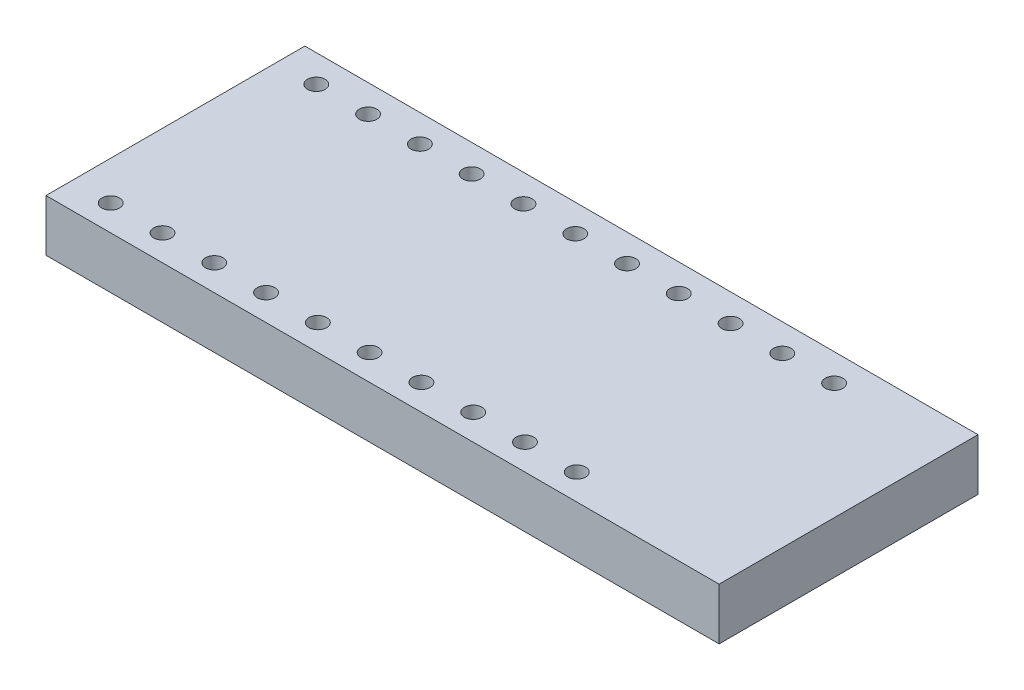
ISO-10303-21;
HEADER;
FILE_DESCRIPTION(('STEP AP214'),'2;1');
FILE_NAME('part.step','',(''),(''),'','','');
FILE_SCHEMA(('AUTOMOTIVE_DESIGN { 1 0 10303 214 1 1 1 1 }'));
ENDSEC;
DATA;
#1=APPLICATION_CONTEXT('core data for automotive mechanical design processes');
#2=APPLICATION_PROTOCOL_DEFINITION('international standard','automotive_design',2000,#1);
#3=PRODUCT_CONTEXT('',#1,'mechanical');
#4=PRODUCT('Part','Part','',(#3));
#5=PRODUCT_RELATED_PRODUCT_CATEGORY('part','',(#4));
#6=PRODUCT_DEFINITION_FORMATION('','',#4);
#7=PRODUCT_DEFINITION_CONTEXT('part definition',#1,'design');
#8=PRODUCT_DEFINITION('design','',#6,#7);
#9=PRODUCT_DEFINITION_SHAPE('','',#8);
#10=(LENGTH_UNIT() NAMED_UNIT(*) SI_UNIT(.MILLI.,.METRE.));
#11=(NAMED_UNIT(*) PLANE_ANGLE_UNIT() SI_UNIT($,.RADIAN.));
#12=(NAMED_UNIT(*) SI_UNIT($,.STERADIAN.) SOLID_ANGLE_UNIT());
#13=UNCERTAINTY_MEASURE_WITH_UNIT(LENGTH_MEASURE(1.E-05),#10,'distance_accuracy_value','');
#14=(GEOMETRIC_REPRESENTATION_CONTEXT(3) GLOBAL_UNCERTAINTY_ASSIGNED_CONTEXT((#13)) GLOBAL_UNIT_ASSIGNED_CONTEXT((#10,
#11,#12)) REPRESENTATION_CONTEXT('',''));
#15=CARTESIAN_POINT('',(0.,0.,0.));
#16=DIRECTION('',(0.,0.,1.));
#17=DIRECTION('',(1.,0.,0.));
#18=AXIS2_PLACEMENT_3D('',#15,#16,#17);
#19=CARTESIAN_POINT('',(-1.46746064493749E-13,432.678485814157,0.));
#20=DIRECTION('',(0.,1.,0.));
#21=DIRECTION('',(-1.,0.,0.));
#22=AXIS2_PLACEMENT_3D('',#19,#20,#21);
#23=PLANE('',#22);
#24=DIRECTION('',(1.,0.,0.));
#25=VECTOR('',#24,1.);
#26=CARTESIAN_POINT('',(-74.1708234911027,432.678485814157,-31.75));
#27=LINE('',#26,#25);
#28=CARTESIAN_POINT('',(-239.270823491103,432.678485814157,-31.75));
#29=VERTEX_POINT('',#28);
#30=CARTESIAN_POINT('',(-74.1708234911027,432.678485814157,-31.75));
#31=VERTEX_POINT('',#30);
#32=EDGE_CURVE('E171',#29,#31,#27,.T.);
#33=ORIENTED_EDGE('',*,*,#32,.T.);
#34=DIRECTION('',(0.,0.,1.));
#35=VECTOR('',#34,1.);
#36=CARTESIAN_POINT('',(-74.1708234911027,432.678485814157,-31.75));
#37=LINE('',#36,#35);
#38=CARTESIAN_POINT('',(-74.1708234911027,432.678485814157,31.75));
#39=VERTEX_POINT('',#38);
#40=EDGE_CURVE('E83',#31,#39,#37,.T.);
#41=ORIENTED_EDGE('',*,*,#40,.T.);
#42=DIRECTION('',(-1.,0.,0.));
#43=VECTOR('',#42,1.);
#44=CARTESIAN_POINT('',(-74.1708234911027,432.678485814157,31.75));
#45=LINE('',#44,#43);
#46=CARTESIAN_POINT('',(-239.270823491103,432.678485814157,31.75));
#47=VERTEX_POINT('',#46);
#48=EDGE_CURVE('E56',#39,#47,#45,.T.);
#49=ORIENTED_EDGE('',*,*,#48,.T.);
#50=DIRECTION('',(0.,0.,-1.));
#51=VECTOR('',#50,1.);
#52=CARTESIAN_POINT('',(-239.270823491103,432.678485814157,-31.75));
#53=LINE('',#52,#51);
#54=EDGE_CURVE('E53',#47,#29,#53,.T.);
#55=ORIENTED_EDGE('',*,*,#54,.T.);
#56=EDGE_LOOP('',(#33,#41,#49,#55));
#57=FACE_BOUND('',#56,.T.);
#58=CARTESIAN_POINT('',(-115.445823491103,432.678485814157,25.4000000000008));
#59=DIRECTION('',(0.,-1.,0.));
#60=DIRECTION('',(1.,0.,0.));
#61=AXIS2_PLACEMENT_3D('',#58,#59,#60);
#62=CIRCLE('',#61,2.15899999999999);
#63=CARTESIAN_POINT('',(-113.286823491103,432.678485814157,25.4000000000008));
#64=VERTEX_POINT('',#63);
#65=EDGE_CURVE('E166',#64,#64,#62,.T.);
#66=ORIENTED_EDGE('',*,*,#65,.F.);
#67=EDGE_LOOP('',(#66));
#68=FACE_BOUND('',#67,.T.);
#69=CARTESIAN_POINT('',(-128.145823491103,432.678485814157,25.4000000000007));
#70=DIRECTION('',(0.,-1.,0.));
#71=DIRECTION('',(1.,0.,0.));
#72=AXIS2_PLACEMENT_3D('',#69,#70,#71);
#73=CIRCLE('',#72,2.15899999999999);
#74=CARTESIAN_POINT('',(-125.986823491103,432.678485814157,25.4000000000007));
#75=VERTEX_POINT('',#74);
#76=EDGE_CURVE('E164',#75,#75,#73,.T.);
#77=ORIENTED_EDGE('',*,*,#76,.F.);
#78=EDGE_LOOP('',(#77));
#79=FACE_BOUND('',#78,.T.);
#80=CARTESIAN_POINT('',(-140.845823491103,432.678485814157,25.4000000000006));
#81=DIRECTION('',(0.,-1.,0.));
#82=DIRECTION('',(1.,0.,0.));
#83=AXIS2_PLACEMENT_3D('',#80,#81,#82);
#84=CIRCLE('',#83,2.15899999999999);
#85=CARTESIAN_POINT('',(-138.686823491103,432.678485814157,25.4000000000006));
#86=VERTEX_POINT('',#85);
#87=EDGE_CURVE('E162',#86,#86,#84,.T.);
#88=ORIENTED_EDGE('',*,*,#87,.F.);
#89=EDGE_LOOP('',(#88));
#90=FACE_BOUND('',#89,.T.);
#91=CARTESIAN_POINT('',(-153.545823491103,432.678485814157,25.4000000000005));
#92=DIRECTION('',(0.,-1.,0.));
#93=DIRECTION('',(1.,0.,0.));
#94=AXIS2_PLACEMENT_3D('',#91,#92,#93);
#95=CIRCLE('',#94,2.15899999999999);
#96=CARTESIAN_POINT('',(-151.386823491103,432.678485814157,25.4000000000005));
#97=VERTEX_POINT('',#96);
#98=EDGE_CURVE('E158',#97,#97,#95,.T.);
#99=ORIENTED_EDGE('',*,*,#98,.F.);
#100=EDGE_LOOP('',(#99));
#101=FACE_BOUND('',#100,.T.);
#102=CARTESIAN_POINT('',(-166.245823491103,432.678485814157,25.4000000000004));
#103=DIRECTION('',(0.,-1.,0.));
#104=DIRECTION('',(1.,0.,0.));
#105=AXIS2_PLACEMENT_3D('',#102,#103,#104);
#106=CIRCLE('',#105,2.15899999999999);
#107=CARTESIAN_POINT('',(-164.086823491103,432.678485814157,25.4000000000004));
#108=VERTEX_POINT('',#107);
#109=EDGE_CURVE('E156',#108,#108,#106,.T.);
#110=ORIENTED_EDGE('',*,*,#109,.F.);
#111=EDGE_LOOP('',(#110));
#112=FACE_BOUND('',#111,.T.);
#113=CARTESIAN_POINT('',(-178.945823491103,432.678485814157,25.4000000000004));
#114=DIRECTION('',(0.,-1.,0.));
#115=DIRECTION('',(1.,0.,0.));
#116=AXIS2_PLACEMENT_3D('',#113,#114,#115);
#117=CIRCLE('',#116,2.15899999999997);
#118=CARTESIAN_POINT('',(-176.786823491103,432.678485814157,25.4000000000004));
#119=VERTEX_POINT('',#118);
#120=EDGE_CURVE('E155',#119,#119,#117,.T.);
#121=ORIENTED_EDGE('',*,*,#120,.F.);
#122=EDGE_LOOP('',(#121));
#123=FACE_BOUND('',#122,.T.);
#124=CARTESIAN_POINT('',(-191.645823491103,432.678485814157,25.4000000000003));
#125=DIRECTION('',(0.,-1.,0.));
#126=DIRECTION('',(1.,0.,0.));
#127=AXIS2_PLACEMENT_3D('',#124,#125,#126);
#128=CIRCLE('',#127,2.15899999999999);
#129=CARTESIAN_POINT('',(-189.486823491103,432.678485814157,25.4000000000003));
#130=VERTEX_POINT('',#129);
#131=EDGE_CURVE('E146',#130,#130,#128,.T.);
#132=ORIENTED_EDGE('',*,*,#131,.F.);
#133=EDGE_LOOP('',(#132));
#134=FACE_BOUND('',#133,.T.);
#135=CARTESIAN_POINT('',(-204.345823491103,432.678485814157,25.4000000000002));
#136=DIRECTION('',(0.,-1.,0.));
#137=DIRECTION('',(1.,0.,0.));
#138=AXIS2_PLACEMENT_3D('',#135,#136,#137);
#139=CIRCLE('',#138,2.15899999999999);
#140=CARTESIAN_POINT('',(-202.186823491103,432.678485814157,25.4000000000002));
#141=VERTEX_POINT('',#140);
#142=EDGE_CURVE('E150',#141,#141,#139,.T.);
#143=ORIENTED_EDGE('',*,*,#142,.F.);
#144=EDGE_LOOP('',(#143));
#145=FACE_BOUND('',#144,.T.);
#146=CARTESIAN_POINT('',(-217.045823491103,432.678485814157,25.4000000000001));
#147=DIRECTION('',(0.,-1.,0.));
#148=DIRECTION('',(1.,0.,0.));
#149=AXIS2_PLACEMENT_3D('',#146,#147,#148);
#150=CIRCLE('',#149,2.15899999999999);
#151=CARTESIAN_POINT('',(-214.886823491103,432.678485814157,25.4000000000001));
#152=VERTEX_POINT('',#151);
#153=EDGE_CURVE('E144',#152,#152,#150,.T.);
#154=ORIENTED_EDGE('',*,*,#153,.F.);
#155=EDGE_LOOP('',(#154));
#156=FACE_BOUND('',#155,.T.);
#157=CARTESIAN_POINT('',(-229.745823491103,432.678485814157,25.4));
#158=DIRECTION('',(0.,-1.,0.));
#159=DIRECTION('',(1.,0.,0.));
#160=AXIS2_PLACEMENT_3D('',#157,#158,#159);
#161=CIRCLE('',#160,2.15899999999999);
#162=CARTESIAN_POINT('',(-227.586823491103,432.678485814157,25.4));
#163=VERTEX_POINT('',#162);
#164=EDGE_CURVE('E142',#163,#163,#161,.T.);
#165=ORIENTED_EDGE('',*,*,#164,.F.);
#166=EDGE_LOOP('',(#165));
#167=FACE_BOUND('',#166,.T.);
#168=CARTESIAN_POINT('',(-102.745823491103,432.678485814157,-25.0288032871512));
#169=DIRECTION('',(0.,-1.,0.));
#170=DIRECTION('',(1.,0.,0.));
#171=AXIS2_PLACEMENT_3D('',#168,#169,#170);
#172=CIRCLE('',#171,2.15899999999999);
#173=CARTESIAN_POINT('',(-100.586823491103,432.678485814157,-25.0288032871512));
#174=VERTEX_POINT('',#173);
#175=EDGE_CURVE('E139',#174,#174,#172,.T.);
#176=ORIENTED_EDGE('',*,*,#175,.F.);
#177=EDGE_LOOP('',(#176));
#178=FACE_BOUND('',#177,.T.);
#179=CARTESIAN_POINT('',(-115.445823491103,432.678485814157,-25.0288032871513));
#180=DIRECTION('',(0.,-1.,0.));
#181=DIRECTION('',(1.,0.,0.));
#182=AXIS2_PLACEMENT_3D('',#179,#180,#181);
#183=CIRCLE('',#182,2.15899999999999);
#184=CARTESIAN_POINT('',(-113.286823491103,432.678485814157,-25.0288032871513));
#185=VERTEX_POINT('',#184);
#186=EDGE_CURVE('E133',#185,#185,#183,.T.);
#187=ORIENTED_EDGE('',*,*,#186,.F.);
#188=EDGE_LOOP('',(#187));
#189=FACE_BOUND('',#188,.T.);
#190=CARTESIAN_POINT('',(-128.145823491103,432.678485814157,-25.0288032871514));
#191=DIRECTION('',(0.,-1.,0.));
#192=DIRECTION('',(1.,0.,0.));
#193=AXIS2_PLACEMENT_3D('',#190,#191,#192);
#194=CIRCLE('',#193,2.15899999999999);
#195=CARTESIAN_POINT('',(-125.986823491103,432.678485814157,-25.0288032871514));
#196=VERTEX_POINT('',#195);
#197=EDGE_CURVE('E134',#196,#196,#194,.T.);
#198=ORIENTED_EDGE('',*,*,#197,.F.);
#199=EDGE_LOOP('',(#198));
#200=FACE_BOUND('',#199,.T.);
#201=CARTESIAN_POINT('',(-140.845823491103,432.678485814157,-25.0288032871515));
#202=DIRECTION('',(0.,-1.,0.));
#203=DIRECTION('',(1.,0.,0.));
#204=AXIS2_PLACEMENT_3D('',#201,#202,#203);
#205=CIRCLE('',#204,2.15899999999999);
#206=CARTESIAN_POINT('',(-138.686823491103,432.678485814157,-25.0288032871515));
#207=VERTEX_POINT('',#206);
#208=EDGE_CURVE('E129',#207,#207,#205,.T.);
#209=ORIENTED_EDGE('',*,*,#208,.F.);
#210=EDGE_LOOP('',(#209));
#211=FACE_BOUND('',#210,.T.);
#212=CARTESIAN_POINT('',(-153.545823491103,432.678485814157,-25.0288032871515));
#213=DIRECTION('',(0.,-1.,0.));
#214=DIRECTION('',(1.,0.,0.));
#215=AXIS2_PLACEMENT_3D('',#212,#213,#214);
#216=CIRCLE('',#215,2.15899999999999);
#217=CARTESIAN_POINT('',(-151.386823491103,432.678485814157,-25.0288032871515));
#218=VERTEX_POINT('',#217);
#219=EDGE_CURVE('E127',#218,#218,#216,.T.);
#220=ORIENTED_EDGE('',*,*,#219,.F.);
#221=EDGE_LOOP('',(#220));
#222=FACE_BOUND('',#221,.T.);
#223=CARTESIAN_POINT('',(-166.245823491103,432.678485814157,-25.0288032871516));
#224=DIRECTION('',(0.,-1.,0.));
#225=DIRECTION('',(1.,0.,0.));
#226=AXIS2_PLACEMENT_3D('',#223,#224,#225);
#227=CIRCLE('',#226,2.15899999999999);
#228=CARTESIAN_POINT('',(-164.086823491103,432.678485814157,-25.0288032871516));
#229=VERTEX_POINT('',#228);
#230=EDGE_CURVE('E124',#229,#229,#227,.T.);
#231=ORIENTED_EDGE('',*,*,#230,.F.);
#232=EDGE_LOOP('',(#231));
#233=FACE_BOUND('',#232,.T.);
#234=CARTESIAN_POINT('',(-178.945823491103,432.678485814157,-25.0288032871517));
#235=DIRECTION('',(0.,-1.,0.));
#236=DIRECTION('',(1.,0.,0.));
#237=AXIS2_PLACEMENT_3D('',#234,#235,#236);
#238=CIRCLE('',#237,2.15899999999997);
#239=CARTESIAN_POINT('',(-176.786823491103,432.678485814157,-25.0288032871517));
#240=VERTEX_POINT('',#239);
#241=EDGE_CURVE('E119',#240,#240,#238,.T.);
#242=ORIENTED_EDGE('',*,*,#241,.F.);
#243=EDGE_LOOP('',(#242));
#244=FACE_BOUND('',#243,.T.);
#245=CARTESIAN_POINT('',(-191.645823491103,432.678485814157,-25.0288032871518));
#246=DIRECTION('',(0.,-1.,0.));
#247=DIRECTION('',(1.,0.,0.));
#248=AXIS2_PLACEMENT_3D('',#245,#246,#247);
#249=CIRCLE('',#248,2.15899999999999);
#250=CARTESIAN_POINT('',(-189.486823491103,432.678485814157,-25.0288032871518));
#251=VERTEX_POINT('',#250);
#252=EDGE_CURVE('E120',#251,#251,#249,.T.);
#253=ORIENTED_EDGE('',*,*,#252,.F.);
#254=EDGE_LOOP('',(#253));
#255=FACE_BOUND('',#254,.T.);
#256=CARTESIAN_POINT('',(-204.345823491103,432.678485814157,-25.0288032871519));
#257=DIRECTION('',(0.,-1.,0.));
#258=DIRECTION('',(1.,0.,0.));
#259=AXIS2_PLACEMENT_3D('',#256,#257,#258);
#260=CIRCLE('',#259,2.15899999999999);
#261=CARTESIAN_POINT('',(-202.186823491103,432.678485814157,-25.0288032871519));
#262=VERTEX_POINT('',#261);
#263=EDGE_CURVE('E112',#262,#262,#260,.T.);
#264=ORIENTED_EDGE('',*,*,#263,.F.);
#265=EDGE_LOOP('',(#264));
#266=FACE_BOUND('',#265,.T.);
#267=CARTESIAN_POINT('',(-217.045823491103,432.678485814157,-25.028803287152));
#268=DIRECTION('',(0.,-1.,0.));
#269=DIRECTION('',(1.,0.,0.));
#270=AXIS2_PLACEMENT_3D('',#267,#268,#269);
#271=CIRCLE('',#270,2.15899999999999);
#272=CARTESIAN_POINT('',(-214.886823491103,432.678485814157,-25.028803287152));
#273=VERTEX_POINT('',#272);
#274=EDGE_CURVE('E111',#273,#273,#271,.T.);
#275=ORIENTED_EDGE('',*,*,#274,.F.);
#276=EDGE_LOOP('',(#275));
#277=FACE_BOUND('',#276,.T.);
#278=CARTESIAN_POINT('',(-229.745823491103,432.678485814157,-25.0288032871521));
#279=DIRECTION('',(0.,-1.,0.));
#280=DIRECTION('',(1.,0.,0.));
#281=AXIS2_PLACEMENT_3D('',#278,#279,#280);
#282=CIRCLE('',#281,2.15899999999999);
#283=CARTESIAN_POINT('',(-227.586823491103,432.678485814157,-25.0288032871521));
#284=VERTEX_POINT('',#283);
#285=EDGE_CURVE('E108',#284,#284,#282,.T.);
#286=ORIENTED_EDGE('',*,*,#285,.F.);
#287=EDGE_LOOP('',(#286));
#288=FACE_BOUND('',#287,.T.);
#289=ADVANCED_FACE('F39',(#57,#68,#79,#90,#101,#112,#123,#134,#145,#156,#167,#178,#189,#200,
#211,#222,#233,#244,#255,#266,#277,#288),#23,.F.);
#290=CARTESIAN_POINT('',(-74.1708234911027,432.678485814157,-31.75));
#291=DIRECTION('',(0.,0.,1.));
#292=DIRECTION('',(1.,0.,0.));
#293=AXIS2_PLACEMENT_3D('',#290,#291,#292);
#294=PLANE('',#293);
#295=DIRECTION('',(0.,1.,0.));
#296=VECTOR('',#295,1.);
#297=CARTESIAN_POINT('',(-239.270823491103,432.678485814157,-31.75));
#298=LINE('',#297,#296);
#299=CARTESIAN_POINT('',(-239.270823491103,445.378485814157,-31.75));
#300=VERTEX_POINT('',#299);
#301=EDGE_CURVE('E97',#29,#300,#298,.T.);
#302=ORIENTED_EDGE('',*,*,#301,.T.);
#303=DIRECTION('',(1.,0.,0.));
#304=VECTOR('',#303,1.);
#305=CARTESIAN_POINT('',(-74.1708234911027,445.378485814158,-31.75));
#306=LINE('',#305,#304);
#307=CARTESIAN_POINT('',(-74.1708234911027,445.378485814158,-31.75));
#308=VERTEX_POINT('',#307);
#309=EDGE_CURVE('E92',#300,#308,#306,.T.);
#310=ORIENTED_EDGE('',*,*,#309,.T.);
#311=DIRECTION('',(0.,1.,0.));
#312=VECTOR('',#311,1.);
#313=CARTESIAN_POINT('',(-74.1708234911027,432.678485814157,-31.75));
#314=LINE('',#313,#312);
#315=EDGE_CURVE('E11',#31,#308,#314,.T.);
#316=ORIENTED_EDGE('',*,*,#315,.F.);
#317=ORIENTED_EDGE('',*,*,#32,.F.);
#318=EDGE_LOOP('',(#302,#310,#316,#317));
#319=FACE_BOUND('',#318,.T.);
#320=ADVANCED_FACE('F41',(#319),#294,.F.);
#321=CARTESIAN_POINT('',(-74.1708234911027,432.678485814157,-31.75));
#322=DIRECTION('',(-1.,0.,0.));
#323=DIRECTION('',(0.,-1.,0.));
#324=AXIS2_PLACEMENT_3D('',#321,#322,#323);
#325=PLANE('',#324);
#326=ORIENTED_EDGE('',*,*,#315,.T.);
#327=DIRECTION('',(0.,0.,1.));
#328=VECTOR('',#327,1.);
#329=CARTESIAN_POINT('',(-74.1708234911027,445.378485814158,-31.75));
#330=LINE('',#329,#328);
#331=CARTESIAN_POINT('',(-74.1708234911027,445.378485814158,31.75));
#332=VERTEX_POINT('',#331);
#333=EDGE_CURVE('E85',#308,#332,#330,.T.);
#334=ORIENTED_EDGE('',*,*,#333,.T.);
#335=DIRECTION('',(0.,1.,0.));
#336=VECTOR('',#335,1.);
#337=CARTESIAN_POINT('',(-74.1708234911027,432.678485814157,31.75));
#338=LINE('',#337,#336);
#339=EDGE_CURVE('E50',#39,#332,#338,.T.);
#340=ORIENTED_EDGE('',*,*,#339,.F.);
#341=ORIENTED_EDGE('',*,*,#40,.F.);
#342=EDGE_LOOP('',(#326,#334,#340,#341));
#343=FACE_BOUND('',#342,.T.);
#344=ADVANCED_FACE('F78',(#343),#325,.F.);
#345=CARTESIAN_POINT('',(-74.1708234911027,432.678485814157,31.75));
#346=DIRECTION('',(0.,0.,-1.));
#347=DIRECTION('',(-1.,0.,0.));
#348=AXIS2_PLACEMENT_3D('',#345,#346,#347);
#349=PLANE('',#348);
#350=ORIENTED_EDGE('',*,*,#339,.T.);
#351=DIRECTION('',(-1.,0.,0.));
#352=VECTOR('',#351,1.);
#353=CARTESIAN_POINT('',(-74.1708234911027,445.378485814158,31.75));
#354=LINE('',#353,#352);
#355=CARTESIAN_POINT('',(-239.270823491103,445.378485814157,31.75));
#356=VERTEX_POINT('',#355);
#357=EDGE_CURVE('E95',#332,#356,#354,.T.);
#358=ORIENTED_EDGE('',*,*,#357,.T.);
#359=DIRECTION('',(0.,1.,0.));
#360=VECTOR('',#359,1.);
#361=CARTESIAN_POINT('',(-239.270823491103,432.678485814157,31.75));
#362=LINE('',#361,#360);
#363=EDGE_CURVE('E180',#47,#356,#362,.T.);
#364=ORIENTED_EDGE('',*,*,#363,.F.);
#365=ORIENTED_EDGE('',*,*,#48,.F.);
#366=EDGE_LOOP('',(#350,#358,#364,#365));
#367=FACE_BOUND('',#366,.T.);
#368=ADVANCED_FACE('F177',(#367),#349,.F.);
#369=CARTESIAN_POINT('',(-239.270823491103,432.678485814157,-31.75));
#370=DIRECTION('',(1.,0.,0.));
#371=DIRECTION('',(0.,1.,0.));
#372=AXIS2_PLACEMENT_3D('',#369,#370,#371);
#373=PLANE('',#372);
#374=ORIENTED_EDGE('',*,*,#363,.T.);
#375=DIRECTION('',(0.,0.,-1.));
#376=VECTOR('',#375,1.);
#377=CARTESIAN_POINT('',(-239.270823491103,445.378485814157,-31.75));
#378=LINE('',#377,#376);
#379=EDGE_CURVE('E106',#356,#300,#378,.T.);
#380=ORIENTED_EDGE('',*,*,#379,.T.);
#381=ORIENTED_EDGE('',*,*,#301,.F.);
#382=ORIENTED_EDGE('',*,*,#54,.F.);
#383=EDGE_LOOP('',(#374,#380,#381,#382));
#384=FACE_BOUND('',#383,.T.);
#385=ADVANCED_FACE('F181',(#384),#373,.F.);
#386=CARTESIAN_POINT('',(-115.445823491103,432.678485814157,25.4000000000008));
#387=DIRECTION('',(0.,1.,0.));
#388=DIRECTION('',(-1.,0.,0.));
#389=AXIS2_PLACEMENT_3D('',#386,#387,#388);
#390=CYLINDRICAL_SURFACE('',#389,2.15899999999999);
#391=ORIENTED_EDGE('',*,*,#65,.T.);
#392=EDGE_LOOP('',(#391));
#393=FACE_BOUND('',#392,.T.);
#394=CARTESIAN_POINT('',(-115.445823491103,445.378485814158,25.4000000000008));
#395=DIRECTION('',(0.,-1.,0.));
#396=DIRECTION('',(1.,0.,0.));
#397=AXIS2_PLACEMENT_3D('',#394,#395,#396);
#398=CIRCLE('',#397,2.15899999999999);
#399=CARTESIAN_POINT('',(-113.286823491103,445.378485814158,25.4000000000008));
#400=VERTEX_POINT('',#399);
#401=EDGE_CURVE('E96',#400,#400,#398,.T.);
#402=ORIENTED_EDGE('',*,*,#401,.F.);
#403=EDGE_LOOP('',(#402));
#404=FACE_BOUND('',#403,.T.);
#405=ADVANCED_FACE('F299',(#393,#404),#390,.F.);
#406=CARTESIAN_POINT('',(-128.145823491103,432.678485814157,25.4000000000007));
#407=DIRECTION('',(0.,1.,0.));
#408=DIRECTION('',(-1.,0.,0.));
#409=AXIS2_PLACEMENT_3D('',#406,#407,#408);
#410=CYLINDRICAL_SURFACE('',#409,2.15899999999999);
#411=ORIENTED_EDGE('',*,*,#76,.T.);
#412=EDGE_LOOP('',(#411));
#413=FACE_BOUND('',#412,.T.);
#414=CARTESIAN_POINT('',(-128.145823491103,445.378485814158,25.4000000000007));
#415=DIRECTION('',(0.,-1.,0.));
#416=DIRECTION('',(1.,0.,0.));
#417=AXIS2_PLACEMENT_3D('',#414,#415,#416);
#418=CIRCLE('',#417,2.15899999999999);
#419=CARTESIAN_POINT('',(-125.986823491103,445.378485814158,25.4000000000007));
#420=VERTEX_POINT('',#419);
#421=EDGE_CURVE('E103',#420,#420,#418,.T.);
#422=ORIENTED_EDGE('',*,*,#421,.F.);
#423=EDGE_LOOP('',(#422));
#424=FACE_BOUND('',#423,.T.);
#425=ADVANCED_FACE('F298',(#413,#424),#410,.F.);
#426=CARTESIAN_POINT('',(-140.845823491103,432.678485814157,25.4000000000006));
#427=DIRECTION('',(0.,1.,0.));
#428=DIRECTION('',(-1.,0.,0.));
#429=AXIS2_PLACEMENT_3D('',#426,#427,#428);
#430=CYLINDRICAL_SURFACE('',#429,2.15899999999999);
#431=ORIENTED_EDGE('',*,*,#87,.T.);
#432=EDGE_LOOP('',(#431));
#433=FACE_BOUND('',#432,.T.);
#434=CARTESIAN_POINT('',(-140.845823491103,445.378485814158,25.4000000000006));
#435=DIRECTION('',(0.,-1.,0.));
#436=DIRECTION('',(1.,0.,0.));
#437=AXIS2_PLACEMENT_3D('',#434,#435,#436);
#438=CIRCLE('',#437,2.15899999999999);
#439=CARTESIAN_POINT('',(-138.686823491103,445.378485814158,25.4000000000006));
#440=VERTEX_POINT('',#439);
#441=EDGE_CURVE('E288',#440,#440,#438,.T.);
#442=ORIENTED_EDGE('',*,*,#441,.F.);
#443=EDGE_LOOP('',(#442));
#444=FACE_BOUND('',#443,.T.);
#445=ADVANCED_FACE('F296',(#433,#444),#430,.F.);
#446=CARTESIAN_POINT('',(-153.545823491103,432.678485814157,25.4000000000005));
#447=DIRECTION('',(0.,1.,0.));
#448=DIRECTION('',(-1.,0.,0.));
#449=AXIS2_PLACEMENT_3D('',#446,#447,#448);
#450=CYLINDRICAL_SURFACE('',#449,2.15899999999999);
#451=ORIENTED_EDGE('',*,*,#98,.T.);
#452=EDGE_LOOP('',(#451));
#453=FACE_BOUND('',#452,.T.);
#454=CARTESIAN_POINT('',(-153.545823491103,445.378485814158,25.4000000000005));
#455=DIRECTION('',(0.,-1.,0.));
#456=DIRECTION('',(1.,0.,0.));
#457=AXIS2_PLACEMENT_3D('',#454,#455,#456);
#458=CIRCLE('',#457,2.15899999999999);
#459=CARTESIAN_POINT('',(-151.386823491103,445.378485814158,25.4000000000005));
#460=VERTEX_POINT('',#459);
#461=EDGE_CURVE('E286',#460,#460,#458,.T.);
#462=ORIENTED_EDGE('',*,*,#461,.F.);
#463=EDGE_LOOP('',(#462));
#464=FACE_BOUND('',#463,.T.);
#465=ADVANCED_FACE('F306',(#453,#464),#450,.F.);
#466=CARTESIAN_POINT('',(-166.245823491103,432.678485814157,25.4000000000004));
#467=DIRECTION('',(0.,1.,0.));
#468=DIRECTION('',(-1.,0.,0.));
#469=AXIS2_PLACEMENT_3D('',#466,#467,#468);
#470=CYLINDRICAL_SURFACE('',#469,2.15899999999999);
#471=ORIENTED_EDGE('',*,*,#109,.T.);
#472=EDGE_LOOP('',(#471));
#473=FACE_BOUND('',#472,.T.);
#474=CARTESIAN_POINT('',(-166.245823491103,445.378485814158,25.4000000000004));
#475=DIRECTION('',(0.,-1.,0.));
#476=DIRECTION('',(1.,0.,0.));
#477=AXIS2_PLACEMENT_3D('',#474,#475,#476);
#478=CIRCLE('',#477,2.15899999999999);
#479=CARTESIAN_POINT('',(-164.086823491103,445.378485814158,25.4000000000004));
#480=VERTEX_POINT('',#479);
#481=EDGE_CURVE('E285',#480,#480,#478,.T.);
#482=ORIENTED_EDGE('',*,*,#481,.F.);
#483=EDGE_LOOP('',(#482));
#484=FACE_BOUND('',#483,.T.);
#485=ADVANCED_FACE('F362',(#473,#484),#470,.F.);
#486=CARTESIAN_POINT('',(-178.945823491103,432.678485814157,25.4000000000004));
#487=DIRECTION('',(0.,1.,0.));
#488=DIRECTION('',(-1.,0.,0.));
#489=AXIS2_PLACEMENT_3D('',#486,#487,#488);
#490=CYLINDRICAL_SURFACE('',#489,2.15899999999997);
#491=ORIENTED_EDGE('',*,*,#120,.T.);
#492=EDGE_LOOP('',(#491));
#493=FACE_BOUND('',#492,.T.);
#494=CARTESIAN_POINT('',(-178.945823491103,445.378485814158,25.4000000000004));
#495=DIRECTION('',(0.,-1.,0.));
#496=DIRECTION('',(1.,0.,0.));
#497=AXIS2_PLACEMENT_3D('',#494,#495,#496);
#498=CIRCLE('',#497,2.15899999999997);
#499=CARTESIAN_POINT('',(-176.786823491103,445.378485814158,25.4000000000004));
#500=VERTEX_POINT('',#499);
#501=EDGE_CURVE('E276',#500,#500,#498,.T.);
#502=ORIENTED_EDGE('',*,*,#501,.F.);
#503=EDGE_LOOP('',(#502));
#504=FACE_BOUND('',#503,.T.);
#505=ADVANCED_FACE('F373',(#493,#504),#490,.F.);
#506=CARTESIAN_POINT('',(-191.645823491103,432.678485814157,25.4000000000003));
#507=DIRECTION('',(0.,1.,0.));
#508=DIRECTION('',(-1.,0.,0.));
#509=AXIS2_PLACEMENT_3D('',#506,#507,#508);
#510=CYLINDRICAL_SURFACE('',#509,2.15899999999999);
#511=ORIENTED_EDGE('',*,*,#131,.T.);
#512=EDGE_LOOP('',(#511));
#513=FACE_BOUND('',#512,.T.);
#514=CARTESIAN_POINT('',(-191.645823491103,445.378485814158,25.4000000000003));
#515=DIRECTION('',(0.,-1.,0.));
#516=DIRECTION('',(1.,0.,0.));
#517=AXIS2_PLACEMENT_3D('',#514,#515,#516);
#518=CIRCLE('',#517,2.15899999999999);
#519=CARTESIAN_POINT('',(-189.486823491103,445.378485814158,25.4000000000003));
#520=VERTEX_POINT('',#519);
#521=EDGE_CURVE('E280',#520,#520,#518,.T.);
#522=ORIENTED_EDGE('',*,*,#521,.F.);
#523=EDGE_LOOP('',(#522));
#524=FACE_BOUND('',#523,.T.);
#525=ADVANCED_FACE('F385',(#513,#524),#510,.F.);
#526=CARTESIAN_POINT('',(-204.345823491103,432.678485814157,25.4000000000002));
#527=DIRECTION('',(0.,1.,0.));
#528=DIRECTION('',(-1.,0.,0.));
#529=AXIS2_PLACEMENT_3D('',#526,#527,#528);
#530=CYLINDRICAL_SURFACE('',#529,2.15899999999999);
#531=ORIENTED_EDGE('',*,*,#142,.T.);
#532=EDGE_LOOP('',(#531));
#533=FACE_BOUND('',#532,.T.);
#534=CARTESIAN_POINT('',(-204.345823491103,445.378485814157,25.4000000000002));
#535=DIRECTION('',(0.,-1.,0.));
#536=DIRECTION('',(1.,0.,0.));
#537=AXIS2_PLACEMENT_3D('',#534,#535,#536);
#538=CIRCLE('',#537,2.15899999999999);
#539=CARTESIAN_POINT('',(-202.186823491103,445.378485814157,25.4000000000002));
#540=VERTEX_POINT('',#539);
#541=EDGE_CURVE('E274',#540,#540,#538,.T.);
#542=ORIENTED_EDGE('',*,*,#541,.F.);
#543=EDGE_LOOP('',(#542));
#544=FACE_BOUND('',#543,.T.);
#545=ADVANCED_FACE('F392',(#533,#544),#530,.F.);
#546=CARTESIAN_POINT('',(-217.045823491103,432.678485814157,25.4000000000001));
#547=DIRECTION('',(0.,1.,0.));
#548=DIRECTION('',(-1.,0.,0.));
#549=AXIS2_PLACEMENT_3D('',#546,#547,#548);
#550=CYLINDRICAL_SURFACE('',#549,2.15899999999999);
#551=ORIENTED_EDGE('',*,*,#153,.T.);
#552=EDGE_LOOP('',(#551));
#553=FACE_BOUND('',#552,.T.);
#554=CARTESIAN_POINT('',(-217.045823491103,445.378485814157,25.4000000000001));
#555=DIRECTION('',(0.,-1.,0.));
#556=DIRECTION('',(1.,0.,0.));
#557=AXIS2_PLACEMENT_3D('',#554,#555,#556);
#558=CIRCLE('',#557,2.15899999999999);
#559=CARTESIAN_POINT('',(-214.886823491103,445.378485814157,25.4000000000001));
#560=VERTEX_POINT('',#559);
#561=EDGE_CURVE('E272',#560,#560,#558,.T.);
#562=ORIENTED_EDGE('',*,*,#561,.F.);
#563=EDGE_LOOP('',(#562));
#564=FACE_BOUND('',#563,.T.);
#565=ADVANCED_FACE('F400',(#553,#564),#550,.F.);
#566=CARTESIAN_POINT('',(-229.745823491103,432.678485814157,25.4));
#567=DIRECTION('',(0.,1.,0.));
#568=DIRECTION('',(-1.,0.,0.));
#569=AXIS2_PLACEMENT_3D('',#566,#567,#568);
#570=CYLINDRICAL_SURFACE('',#569,2.15899999999999);
#571=ORIENTED_EDGE('',*,*,#164,.T.);
#572=EDGE_LOOP('',(#571));
#573=FACE_BOUND('',#572,.T.);
#574=CARTESIAN_POINT('',(-229.745823491103,445.378485814157,25.4));
#575=DIRECTION('',(0.,-1.,0.));
#576=DIRECTION('',(1.,0.,0.));
#577=AXIS2_PLACEMENT_3D('',#574,#575,#576);
#578=CIRCLE('',#577,2.15899999999999);
#579=CARTESIAN_POINT('',(-227.586823491103,445.378485814157,25.4));
#580=VERTEX_POINT('',#579);
#581=EDGE_CURVE('E269',#580,#580,#578,.T.);
#582=ORIENTED_EDGE('',*,*,#581,.F.);
#583=EDGE_LOOP('',(#582));
#584=FACE_BOUND('',#583,.T.);
#585=ADVANCED_FACE('F409',(#573,#584),#570,.F.);
#586=CARTESIAN_POINT('',(-102.745823491103,432.678485814157,-25.0288032871512));
#587=DIRECTION('',(0.,1.,0.));
#588=DIRECTION('',(-1.,0.,0.));
#589=AXIS2_PLACEMENT_3D('',#586,#587,#588);
#590=CYLINDRICAL_SURFACE('',#589,2.15899999999999);
#591=ORIENTED_EDGE('',*,*,#175,.T.);
#592=EDGE_LOOP('',(#591));
#593=FACE_BOUND('',#592,.T.);
#594=CARTESIAN_POINT('',(-102.745823491103,445.378485814158,-25.0288032871512));
#595=DIRECTION('',(0.,-1.,0.));
#596=DIRECTION('',(1.,0.,0.));
#597=AXIS2_PLACEMENT_3D('',#594,#595,#596);
#598=CIRCLE('',#597,2.15899999999999);
#599=CARTESIAN_POINT('',(-100.586823491103,445.378485814158,-25.0288032871512));
#600=VERTEX_POINT('',#599);
#601=EDGE_CURVE('E263',#600,#600,#598,.T.);
#602=ORIENTED_EDGE('',*,*,#601,.F.);
#603=EDGE_LOOP('',(#602));
#604=FACE_BOUND('',#603,.T.);
#605=ADVANCED_FACE('F419',(#593,#604),#590,.F.);
#606=CARTESIAN_POINT('',(-115.445823491103,432.678485814157,-25.0288032871513));
#607=DIRECTION('',(0.,1.,0.));
#608=DIRECTION('',(-1.,0.,0.));
#609=AXIS2_PLACEMENT_3D('',#606,#607,#608);
#610=CYLINDRICAL_SURFACE('',#609,2.15899999999999);
#611=ORIENTED_EDGE('',*,*,#186,.T.);
#612=EDGE_LOOP('',(#611));
#613=FACE_BOUND('',#612,.T.);
#614=CARTESIAN_POINT('',(-115.445823491103,445.378485814158,-25.0288032871513));
#615=DIRECTION('',(0.,-1.,0.));
#616=DIRECTION('',(1.,0.,0.));
#617=AXIS2_PLACEMENT_3D('',#614,#615,#616);
#618=CIRCLE('',#617,2.15899999999999);
#619=CARTESIAN_POINT('',(-113.286823491103,445.378485814158,-25.0288032871513));
#620=VERTEX_POINT('',#619);
#621=EDGE_CURVE('E264',#620,#620,#618,.T.);
#622=ORIENTED_EDGE('',*,*,#621,.F.);
#623=EDGE_LOOP('',(#622));
#624=FACE_BOUND('',#623,.T.);
#625=ADVANCED_FACE('F430',(#613,#624),#610,.F.);
#626=CARTESIAN_POINT('',(-128.145823491103,432.678485814157,-25.0288032871514));
#627=DIRECTION('',(0.,1.,0.));
#628=DIRECTION('',(-1.,0.,0.));
#629=AXIS2_PLACEMENT_3D('',#626,#627,#628);
#630=CYLINDRICAL_SURFACE('',#629,2.15899999999999);
#631=ORIENTED_EDGE('',*,*,#197,.T.);
#632=EDGE_LOOP('',(#631));
#633=FACE_BOUND('',#632,.T.);
#634=CARTESIAN_POINT('',(-128.145823491103,445.378485814158,-25.0288032871514));
#635=DIRECTION('',(0.,-1.,0.));
#636=DIRECTION('',(1.,0.,0.));
#637=AXIS2_PLACEMENT_3D('',#634,#635,#636);
#638=CIRCLE('',#637,2.15899999999999);
#639=CARTESIAN_POINT('',(-125.986823491103,445.378485814158,-25.0288032871514));
#640=VERTEX_POINT('',#639);
#641=EDGE_CURVE('E259',#640,#640,#638,.T.);
#642=ORIENTED_EDGE('',*,*,#641,.F.);
#643=EDGE_LOOP('',(#642));
#644=FACE_BOUND('',#643,.T.);
#645=ADVANCED_FACE('F436',(#633,#644),#630,.F.);
#646=CARTESIAN_POINT('',(-140.845823491103,432.678485814157,-25.0288032871515));
#647=DIRECTION('',(0.,1.,0.));
#648=DIRECTION('',(-1.,0.,0.));
#649=AXIS2_PLACEMENT_3D('',#646,#647,#648);
#650=CYLINDRICAL_SURFACE('',#649,2.15899999999999);
#651=ORIENTED_EDGE('',*,*,#208,.T.);
#652=EDGE_LOOP('',(#651));
#653=FACE_BOUND('',#652,.T.);
#654=CARTESIAN_POINT('',(-140.845823491103,445.378485814158,-25.0288032871515));
#655=DIRECTION('',(0.,-1.,0.));
#656=DIRECTION('',(1.,0.,0.));
#657=AXIS2_PLACEMENT_3D('',#654,#655,#656);
#658=CIRCLE('',#657,2.15899999999999);
#659=CARTESIAN_POINT('',(-138.686823491103,445.378485814158,-25.0288032871515));
#660=VERTEX_POINT('',#659);
#661=EDGE_CURVE('E257',#660,#660,#658,.T.);
#662=ORIENTED_EDGE('',*,*,#661,.F.);
#663=EDGE_LOOP('',(#662));
#664=FACE_BOUND('',#663,.T.);
#665=ADVANCED_FACE('F444',(#653,#664),#650,.F.);
#666=CARTESIAN_POINT('',(-153.545823491103,432.678485814157,-25.0288032871515));
#667=DIRECTION('',(0.,1.,0.));
#668=DIRECTION('',(-1.,0.,0.));
#669=AXIS2_PLACEMENT_3D('',#666,#667,#668);
#670=CYLINDRICAL_SURFACE('',#669,2.15899999999999);
#671=ORIENTED_EDGE('',*,*,#219,.T.);
#672=EDGE_LOOP('',(#671));
#673=FACE_BOUND('',#672,.T.);
#674=CARTESIAN_POINT('',(-153.545823491103,445.378485814158,-25.0288032871515));
#675=DIRECTION('',(0.,-1.,0.));
#676=DIRECTION('',(1.,0.,0.));
#677=AXIS2_PLACEMENT_3D('',#674,#675,#676);
#678=CIRCLE('',#677,2.15899999999999);
#679=CARTESIAN_POINT('',(-151.386823491103,445.378485814158,-25.0288032871515));
#680=VERTEX_POINT('',#679);
#681=EDGE_CURVE('E254',#680,#680,#678,.T.);
#682=ORIENTED_EDGE('',*,*,#681,.F.);
#683=EDGE_LOOP('',(#682));
#684=FACE_BOUND('',#683,.T.);
#685=ADVANCED_FACE('F454',(#673,#684),#670,.F.);
#686=CARTESIAN_POINT('',(-166.245823491103,432.678485814157,-25.0288032871516));
#687=DIRECTION('',(0.,1.,0.));
#688=DIRECTION('',(-1.,0.,0.));
#689=AXIS2_PLACEMENT_3D('',#686,#687,#688);
#690=CYLINDRICAL_SURFACE('',#689,2.15899999999999);
#691=ORIENTED_EDGE('',*,*,#230,.T.);
#692=EDGE_LOOP('',(#691));
#693=FACE_BOUND('',#692,.T.);
#694=CARTESIAN_POINT('',(-166.245823491103,445.378485814158,-25.0288032871516));
#695=DIRECTION('',(0.,-1.,0.));
#696=DIRECTION('',(1.,0.,0.));
#697=AXIS2_PLACEMENT_3D('',#694,#695,#696);
#698=CIRCLE('',#697,2.15899999999999);
#699=CARTESIAN_POINT('',(-164.086823491103,445.378485814158,-25.0288032871516));
#700=VERTEX_POINT('',#699);
#701=EDGE_CURVE('E249',#700,#700,#698,.T.);
#702=ORIENTED_EDGE('',*,*,#701,.F.);
#703=EDGE_LOOP('',(#702));
#704=FACE_BOUND('',#703,.T.);
#705=ADVANCED_FACE('F464',(#693,#704),#690,.F.);
#706=CARTESIAN_POINT('',(-178.945823491103,432.678485814157,-25.0288032871517));
#707=DIRECTION('',(0.,1.,0.));
#708=DIRECTION('',(-1.,0.,0.));
#709=AXIS2_PLACEMENT_3D('',#706,#707,#708);
#710=CYLINDRICAL_SURFACE('',#709,2.15899999999997);
#711=ORIENTED_EDGE('',*,*,#241,.T.);
#712=EDGE_LOOP('',(#711));
#713=FACE_BOUND('',#712,.T.);
#714=CARTESIAN_POINT('',(-178.945823491103,445.378485814158,-25.0288032871517));
#715=DIRECTION('',(0.,-1.,0.));
#716=DIRECTION('',(1.,0.,0.));
#717=AXIS2_PLACEMENT_3D('',#714,#715,#716);
#718=CIRCLE('',#717,2.15899999999997);
#719=CARTESIAN_POINT('',(-176.786823491103,445.378485814158,-25.0288032871517));
#720=VERTEX_POINT('',#719);
#721=EDGE_CURVE('E250',#720,#720,#718,.T.);
#722=ORIENTED_EDGE('',*,*,#721,.F.);
#723=EDGE_LOOP('',(#722));
#724=FACE_BOUND('',#723,.T.);
#725=ADVANCED_FACE('F475',(#713,#724),#710,.F.);
#726=CARTESIAN_POINT('',(-191.645823491103,432.678485814157,-25.0288032871518));
#727=DIRECTION('',(0.,1.,0.));
#728=DIRECTION('',(-1.,0.,0.));
#729=AXIS2_PLACEMENT_3D('',#726,#727,#728);
#730=CYLINDRICAL_SURFACE('',#729,2.15899999999999);
#731=ORIENTED_EDGE('',*,*,#252,.T.);
#732=EDGE_LOOP('',(#731));
#733=FACE_BOUND('',#732,.T.);
#734=CARTESIAN_POINT('',(-191.645823491103,445.378485814158,-25.0288032871518));
#735=DIRECTION('',(0.,-1.,0.));
#736=DIRECTION('',(1.,0.,0.));
#737=AXIS2_PLACEMENT_3D('',#734,#735,#736);
#738=CIRCLE('',#737,2.15899999999999);
#739=CARTESIAN_POINT('',(-189.486823491103,445.378485814158,-25.0288032871518));
#740=VERTEX_POINT('',#739);
#741=EDGE_CURVE('E242',#740,#740,#738,.T.);
#742=ORIENTED_EDGE('',*,*,#741,.F.);
#743=EDGE_LOOP('',(#742));
#744=FACE_BOUND('',#743,.T.);
#745=ADVANCED_FACE('F481',(#733,#744),#730,.F.);
#746=CARTESIAN_POINT('',(-204.345823491103,432.678485814157,-25.0288032871519));
#747=DIRECTION('',(0.,1.,0.));
#748=DIRECTION('',(-1.,0.,0.));
#749=AXIS2_PLACEMENT_3D('',#746,#747,#748);
#750=CYLINDRICAL_SURFACE('',#749,2.15899999999999);
#751=ORIENTED_EDGE('',*,*,#263,.T.);
#752=EDGE_LOOP('',(#751));
#753=FACE_BOUND('',#752,.T.);
#754=CARTESIAN_POINT('',(-204.345823491103,445.378485814157,-25.0288032871519));
#755=DIRECTION('',(0.,-1.,0.));
#756=DIRECTION('',(1.,0.,0.));
#757=AXIS2_PLACEMENT_3D('',#754,#755,#756);
#758=CIRCLE('',#757,2.15899999999999);
#759=CARTESIAN_POINT('',(-202.186823491103,445.378485814157,-25.0288032871519));
#760=VERTEX_POINT('',#759);
#761=EDGE_CURVE('E237',#760,#760,#758,.T.);
#762=ORIENTED_EDGE('',*,*,#761,.F.);
#763=EDGE_LOOP('',(#762));
#764=FACE_BOUND('',#763,.T.);
#765=ADVANCED_FACE('F489',(#753,#764),#750,.F.);
#766=CARTESIAN_POINT('',(-217.045823491103,432.678485814157,-25.028803287152));
#767=DIRECTION('',(0.,1.,0.));
#768=DIRECTION('',(-1.,0.,0.));
#769=AXIS2_PLACEMENT_3D('',#766,#767,#768);
#770=CYLINDRICAL_SURFACE('',#769,2.15899999999999);
#771=ORIENTED_EDGE('',*,*,#274,.T.);
#772=EDGE_LOOP('',(#771));
#773=FACE_BOUND('',#772,.T.);
#774=CARTESIAN_POINT('',(-217.045823491103,445.378485814157,-25.028803287152));
#775=DIRECTION('',(0.,-1.,0.));
#776=DIRECTION('',(1.,0.,0.));
#777=AXIS2_PLACEMENT_3D('',#774,#775,#776);
#778=CIRCLE('',#777,2.15899999999999);
#779=CARTESIAN_POINT('',(-214.886823491103,445.378485814157,-25.028803287152));
#780=VERTEX_POINT('',#779);
#781=EDGE_CURVE('E236',#780,#780,#778,.T.);
#782=ORIENTED_EDGE('',*,*,#781,.F.);
#783=EDGE_LOOP('',(#782));
#784=FACE_BOUND('',#783,.T.);
#785=ADVANCED_FACE('F229',(#773,#784),#770,.F.);
#786=CARTESIAN_POINT('',(-229.745823491103,432.678485814157,-25.0288032871521));
#787=DIRECTION('',(0.,1.,0.));
#788=DIRECTION('',(-1.,0.,0.));
#789=AXIS2_PLACEMENT_3D('',#786,#787,#788);
#790=CYLINDRICAL_SURFACE('',#789,2.15899999999999);
#791=ORIENTED_EDGE('',*,*,#285,.T.);
#792=EDGE_LOOP('',(#791));
#793=FACE_BOUND('',#792,.T.);
#794=CARTESIAN_POINT('',(-229.745823491103,445.378485814157,-25.0288032871521));
#795=DIRECTION('',(0.,-1.,0.));
#796=DIRECTION('',(1.,0.,0.));
#797=AXIS2_PLACEMENT_3D('',#794,#795,#796);
#798=CIRCLE('',#797,2.15899999999999);
#799=CARTESIAN_POINT('',(-227.586823491103,445.378485814157,-25.0288032871521));
#800=VERTEX_POINT('',#799);
#801=EDGE_CURVE('E234',#800,#800,#798,.T.);
#802=ORIENTED_EDGE('',*,*,#801,.F.);
#803=EDGE_LOOP('',(#802));
#804=FACE_BOUND('',#803,.T.);
#805=ADVANCED_FACE('F227',(#793,#804),#790,.F.);
#806=CARTESIAN_POINT('',(-1.48480787969726E-13,445.378485814158,0.));
#807=DIRECTION('',(0.,1.,0.));
#808=DIRECTION('',(-1.,0.,0.));
#809=AXIS2_PLACEMENT_3D('',#806,#807,#808);
#810=PLANE('',#809);
#811=ORIENTED_EDGE('',*,*,#801,.T.);
#812=EDGE_LOOP('',(#811));
#813=FACE_BOUND('',#812,.T.);
#814=ORIENTED_EDGE('',*,*,#781,.T.);
#815=EDGE_LOOP('',(#814));
#816=FACE_BOUND('',#815,.T.);
#817=ORIENTED_EDGE('',*,*,#761,.T.);
#818=EDGE_LOOP('',(#817));
#819=FACE_BOUND('',#818,.T.);
#820=ORIENTED_EDGE('',*,*,#741,.T.);
#821=EDGE_LOOP('',(#820));
#822=FACE_BOUND('',#821,.T.);
#823=ORIENTED_EDGE('',*,*,#721,.T.);
#824=EDGE_LOOP('',(#823));
#825=FACE_BOUND('',#824,.T.);
#826=ORIENTED_EDGE('',*,*,#701,.T.);
#827=EDGE_LOOP('',(#826));
#828=FACE_BOUND('',#827,.T.);
#829=ORIENTED_EDGE('',*,*,#681,.T.);
#830=EDGE_LOOP('',(#829));
#831=FACE_BOUND('',#830,.T.);
#832=ORIENTED_EDGE('',*,*,#661,.T.);
#833=EDGE_LOOP('',(#832));
#834=FACE_BOUND('',#833,.T.);
#835=ORIENTED_EDGE('',*,*,#641,.T.);
#836=EDGE_LOOP('',(#835));
#837=FACE_BOUND('',#836,.T.);
#838=ORIENTED_EDGE('',*,*,#621,.T.);
#839=EDGE_LOOP('',(#838));
#840=FACE_BOUND('',#839,.T.);
#841=ORIENTED_EDGE('',*,*,#601,.T.);
#842=EDGE_LOOP('',(#841));
#843=FACE_BOUND('',#842,.T.);
#844=ORIENTED_EDGE('',*,*,#581,.T.);
#845=EDGE_LOOP('',(#844));
#846=FACE_BOUND('',#845,.T.);
#847=ORIENTED_EDGE('',*,*,#561,.T.);
#848=EDGE_LOOP('',(#847));
#849=FACE_BOUND('',#848,.T.);
#850=ORIENTED_EDGE('',*,*,#541,.T.);
#851=EDGE_LOOP('',(#850));
#852=FACE_BOUND('',#851,.T.);
#853=ORIENTED_EDGE('',*,*,#521,.T.);
#854=EDGE_LOOP('',(#853));
#855=FACE_BOUND('',#854,.T.);
#856=ORIENTED_EDGE('',*,*,#501,.T.);
#857=EDGE_LOOP('',(#856));
#858=FACE_BOUND('',#857,.T.);
#859=ORIENTED_EDGE('',*,*,#481,.T.);
#860=EDGE_LOOP('',(#859));
#861=FACE_BOUND('',#860,.T.);
#862=ORIENTED_EDGE('',*,*,#461,.T.);
#863=EDGE_LOOP('',(#862));
#864=FACE_BOUND('',#863,.T.);
#865=ORIENTED_EDGE('',*,*,#441,.T.);
#866=EDGE_LOOP('',(#865));
#867=FACE_BOUND('',#866,.T.);
#868=ORIENTED_EDGE('',*,*,#421,.T.);
#869=EDGE_LOOP('',(#868));
#870=FACE_BOUND('',#869,.T.);
#871=ORIENTED_EDGE('',*,*,#401,.T.);
#872=EDGE_LOOP('',(#871));
#873=FACE_BOUND('',#872,.T.);
#874=ORIENTED_EDGE('',*,*,#309,.F.);
#875=ORIENTED_EDGE('',*,*,#379,.F.);
#876=ORIENTED_EDGE('',*,*,#357,.F.);
#877=ORIENTED_EDGE('',*,*,#333,.F.);
#878=EDGE_LOOP('',(#874,#875,#876,#877));
#879=FACE_BOUND('',#878,.T.);
#880=ADVANCED_FACE('F88',(#813,#816,#819,#822,#825,#828,#831,#834,#837,#840,#843,#846,#849,#852,
#855,#858,#861,#864,#867,#870,#873,#879),#810,.T.);
#881=CLOSED_SHELL('',(#289,#320,#344,#368,#385,#405,#425,#445,#465,#485,#505,#525,#545,#565,
#585,#605,#625,#645,#665,#685,#705,#725,#745,#765,#785,#805,#880));
#882=MANIFOLD_SOLID_BREP('B2',#881);
#883=ADVANCED_BREP_SHAPE_REPRESENTATION('',(#18,#882),#14);
#884=SHAPE_DEFINITION_REPRESENTATION(#9,#883);
ENDSEC;
END-ISO-10303-21;
